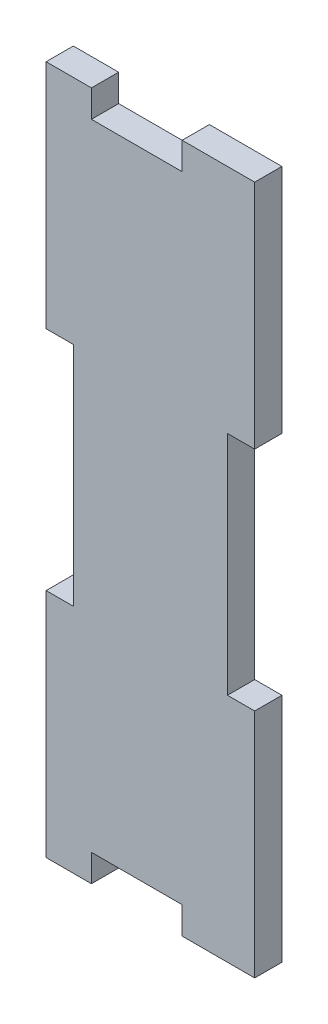
ISO-10303-21;
HEADER;
FILE_DESCRIPTION(('STEP AP214'),'2;1');
FILE_NAME('part.step','',(''),(''),'','','');
FILE_SCHEMA(('AUTOMOTIVE_DESIGN { 1 0 10303 214 1 1 1 1 }'));
ENDSEC;
DATA;
#1=APPLICATION_CONTEXT('core data for automotive mechanical design processes');
#2=APPLICATION_PROTOCOL_DEFINITION('international standard','automotive_design',2000,#1);
#3=PRODUCT_CONTEXT('',#1,'mechanical');
#4=PRODUCT('Part','Part','',(#3));
#5=PRODUCT_RELATED_PRODUCT_CATEGORY('part','',(#4));
#6=PRODUCT_DEFINITION_FORMATION('','',#4);
#7=PRODUCT_DEFINITION_CONTEXT('part definition',#1,'design');
#8=PRODUCT_DEFINITION('design','',#6,#7);
#9=PRODUCT_DEFINITION_SHAPE('','',#8);
#10=(LENGTH_UNIT() NAMED_UNIT(*) SI_UNIT(.MILLI.,.METRE.));
#11=(NAMED_UNIT(*) PLANE_ANGLE_UNIT() SI_UNIT($,.RADIAN.));
#12=(NAMED_UNIT(*) SI_UNIT($,.STERADIAN.) SOLID_ANGLE_UNIT());
#13=UNCERTAINTY_MEASURE_WITH_UNIT(LENGTH_MEASURE(1.E-05),#10,'distance_accuracy_value','');
#14=(GEOMETRIC_REPRESENTATION_CONTEXT(3) GLOBAL_UNCERTAINTY_ASSIGNED_CONTEXT((#13)) GLOBAL_UNIT_ASSIGNED_CONTEXT((#10,
#11,#12)) REPRESENTATION_CONTEXT('',''));
#15=CARTESIAN_POINT('',(0.,0.,0.));
#16=DIRECTION('',(0.,0.,1.));
#17=DIRECTION('',(1.,0.,0.));
#18=AXIS2_PLACEMENT_3D('',#15,#16,#17);
#19=CARTESIAN_POINT('',(5.,76.,3.));
#20=DIRECTION('',(0.,-1.,0.));
#21=DIRECTION('',(0.,0.,-1.));
#22=AXIS2_PLACEMENT_3D('',#19,#20,#21);
#23=PLANE('',#22);
#24=DIRECTION('',(-1.,0.,0.));
#25=VECTOR('',#24,1.);
#26=CARTESIAN_POINT('',(5.,76.,0.));
#27=LINE('',#26,#25);
#28=CARTESIAN_POINT('',(5.,76.,0.));
#29=VERTEX_POINT('',#28);
#30=CARTESIAN_POINT('',(0.,76.,0.));
#31=VERTEX_POINT('',#30);
#32=EDGE_CURVE('E201',#29,#31,#27,.T.);
#33=ORIENTED_EDGE('',*,*,#32,.T.);
#34=DIRECTION('',(0.,0.,-1.));
#35=VECTOR('',#34,1.);
#36=CARTESIAN_POINT('',(0.,76.,3.));
#37=LINE('',#36,#35);
#38=CARTESIAN_POINT('',(0.,76.,3.));
#39=VERTEX_POINT('',#38);
#40=EDGE_CURVE('E11',#39,#31,#37,.T.);
#41=ORIENTED_EDGE('',*,*,#40,.F.);
#42=DIRECTION('',(-1.,0.,0.));
#43=VECTOR('',#42,1.);
#44=CARTESIAN_POINT('',(5.,76.,3.));
#45=LINE('',#44,#43);
#46=CARTESIAN_POINT('',(5.,76.,3.));
#47=VERTEX_POINT('',#46);
#48=EDGE_CURVE('E239',#47,#39,#45,.T.);
#49=ORIENTED_EDGE('',*,*,#48,.F.);
#50=DIRECTION('',(0.,0.,-1.));
#51=VECTOR('',#50,1.);
#52=CARTESIAN_POINT('',(5.,76.,3.));
#53=LINE('',#52,#51);
#54=EDGE_CURVE('E197',#47,#29,#53,.T.);
#55=ORIENTED_EDGE('',*,*,#54,.T.);
#56=EDGE_LOOP('',(#33,#41,#49,#55));
#57=FACE_BOUND('',#56,.T.);
#58=ADVANCED_FACE('F33',(#57),#23,.F.);
#59=CARTESIAN_POINT('',(0.,76.,3.));
#60=DIRECTION('',(1.,0.,0.));
#61=DIRECTION('',(0.,0.,-1.));
#62=AXIS2_PLACEMENT_3D('',#59,#60,#61);
#63=PLANE('',#62);
#64=DIRECTION('',(0.,-1.,0.));
#65=VECTOR('',#64,1.);
#66=CARTESIAN_POINT('',(0.,76.,0.));
#67=LINE('',#66,#65);
#68=CARTESIAN_POINT('',(0.,50.5,0.));
#69=VERTEX_POINT('',#68);
#70=EDGE_CURVE('E204',#31,#69,#67,.T.);
#71=ORIENTED_EDGE('',*,*,#70,.T.);
#72=DIRECTION('',(0.,0.,-1.));
#73=VECTOR('',#72,1.);
#74=CARTESIAN_POINT('',(0.,50.5,3.));
#75=LINE('',#74,#73);
#76=CARTESIAN_POINT('',(0.,50.5,3.));
#77=VERTEX_POINT('',#76);
#78=EDGE_CURVE('E41',#77,#69,#75,.T.);
#79=ORIENTED_EDGE('',*,*,#78,.F.);
#80=DIRECTION('',(0.,-1.,0.));
#81=VECTOR('',#80,1.);
#82=CARTESIAN_POINT('',(0.,76.,3.));
#83=LINE('',#82,#81);
#84=EDGE_CURVE('E128',#39,#77,#83,.T.);
#85=ORIENTED_EDGE('',*,*,#84,.F.);
#86=ORIENTED_EDGE('',*,*,#40,.T.);
#87=EDGE_LOOP('',(#71,#79,#85,#86));
#88=FACE_BOUND('',#87,.T.);
#89=ADVANCED_FACE('F357',(#88),#63,.F.);
#90=CARTESIAN_POINT('',(0.,50.5,3.));
#91=DIRECTION('',(0.,1.,0.));
#92=DIRECTION('',(0.,0.,1.));
#93=AXIS2_PLACEMENT_3D('',#90,#91,#92);
#94=PLANE('',#93);
#95=DIRECTION('',(1.,0.,0.));
#96=VECTOR('',#95,1.);
#97=CARTESIAN_POINT('',(0.,50.5,0.));
#98=LINE('',#97,#96);
#99=CARTESIAN_POINT('',(3.00000000000001,50.5,0.));
#100=VERTEX_POINT('',#99);
#101=EDGE_CURVE('E206',#69,#100,#98,.T.);
#102=ORIENTED_EDGE('',*,*,#101,.T.);
#103=DIRECTION('',(0.,0.,-1.));
#104=VECTOR('',#103,1.);
#105=CARTESIAN_POINT('',(3.00000000000001,50.5,3.));
#106=LINE('',#105,#104);
#107=CARTESIAN_POINT('',(3.00000000000001,50.5,3.));
#108=VERTEX_POINT('',#107);
#109=EDGE_CURVE('E282',#108,#100,#106,.T.);
#110=ORIENTED_EDGE('',*,*,#109,.F.);
#111=DIRECTION('',(1.,0.,0.));
#112=VECTOR('',#111,1.);
#113=CARTESIAN_POINT('',(0.,50.5,3.));
#114=LINE('',#113,#112);
#115=EDGE_CURVE('E290',#77,#108,#114,.T.);
#116=ORIENTED_EDGE('',*,*,#115,.F.);
#117=ORIENTED_EDGE('',*,*,#78,.T.);
#118=EDGE_LOOP('',(#102,#110,#116,#117));
#119=FACE_BOUND('',#118,.T.);
#120=ADVANCED_FACE('F288',(#119),#94,.F.);
#121=CARTESIAN_POINT('',(3.00000000000001,50.5,3.));
#122=DIRECTION('',(1.,0.,0.));
#123=DIRECTION('',(0.,1.,0.));
#124=AXIS2_PLACEMENT_3D('',#121,#122,#123);
#125=PLANE('',#124);
#126=DIRECTION('',(0.,-1.,0.));
#127=VECTOR('',#126,1.);
#128=CARTESIAN_POINT('',(3.00000000000001,50.5,0.));
#129=LINE('',#128,#127);
#130=CARTESIAN_POINT('',(3.00000000000001,25.5,0.));
#131=VERTEX_POINT('',#130);
#132=EDGE_CURVE('E208',#100,#131,#129,.T.);
#133=ORIENTED_EDGE('',*,*,#132,.T.);
#134=DIRECTION('',(0.,0.,-1.));
#135=VECTOR('',#134,1.);
#136=CARTESIAN_POINT('',(3.00000000000001,25.5,3.));
#137=LINE('',#136,#135);
#138=CARTESIAN_POINT('',(3.00000000000001,25.5,3.));
#139=VERTEX_POINT('',#138);
#140=EDGE_CURVE('E279',#139,#131,#137,.T.);
#141=ORIENTED_EDGE('',*,*,#140,.F.);
#142=DIRECTION('',(0.,-1.,0.));
#143=VECTOR('',#142,1.);
#144=CARTESIAN_POINT('',(3.00000000000001,50.5,3.));
#145=LINE('',#144,#143);
#146=EDGE_CURVE('E308',#108,#139,#145,.T.);
#147=ORIENTED_EDGE('',*,*,#146,.F.);
#148=ORIENTED_EDGE('',*,*,#109,.T.);
#149=EDGE_LOOP('',(#133,#141,#147,#148));
#150=FACE_BOUND('',#149,.T.);
#151=ADVANCED_FACE('F299',(#150),#125,.F.);
#152=CARTESIAN_POINT('',(0.,25.5,3.));
#153=DIRECTION('',(0.,-1.,0.));
#154=DIRECTION('',(1.,0.,0.));
#155=AXIS2_PLACEMENT_3D('',#152,#153,#154);
#156=PLANE('',#155);
#157=DIRECTION('',(-1.,0.,0.));
#158=VECTOR('',#157,1.);
#159=CARTESIAN_POINT('',(0.,25.5,0.));
#160=LINE('',#159,#158);
#161=CARTESIAN_POINT('',(0.,25.5,0.));
#162=VERTEX_POINT('',#161);
#163=EDGE_CURVE('E210',#131,#162,#160,.T.);
#164=ORIENTED_EDGE('',*,*,#163,.T.);
#165=DIRECTION('',(0.,0.,-1.));
#166=VECTOR('',#165,1.);
#167=CARTESIAN_POINT('',(0.,25.5,3.));
#168=LINE('',#167,#166);
#169=CARTESIAN_POINT('',(0.,25.5,3.));
#170=VERTEX_POINT('',#169);
#171=EDGE_CURVE('E276',#170,#162,#168,.T.);
#172=ORIENTED_EDGE('',*,*,#171,.F.);
#173=DIRECTION('',(-1.,0.,0.));
#174=VECTOR('',#173,1.);
#175=CARTESIAN_POINT('',(0.,25.5,3.));
#176=LINE('',#175,#174);
#177=EDGE_CURVE('E305',#139,#170,#176,.T.);
#178=ORIENTED_EDGE('',*,*,#177,.F.);
#179=ORIENTED_EDGE('',*,*,#140,.T.);
#180=EDGE_LOOP('',(#164,#172,#178,#179));
#181=FACE_BOUND('',#180,.T.);
#182=ADVANCED_FACE('F303',(#181),#156,.F.);
#183=CARTESIAN_POINT('',(0.,25.5,3.));
#184=DIRECTION('',(1.,0.,0.));
#185=DIRECTION('',(0.,0.,-1.));
#186=AXIS2_PLACEMENT_3D('',#183,#184,#185);
#187=PLANE('',#186);
#188=DIRECTION('',(0.,-1.,0.));
#189=VECTOR('',#188,1.);
#190=CARTESIAN_POINT('',(0.,25.5,0.));
#191=LINE('',#190,#189);
#192=CARTESIAN_POINT('',(0.,0.,0.));
#193=VERTEX_POINT('',#192);
#194=EDGE_CURVE('E212',#162,#193,#191,.T.);
#195=ORIENTED_EDGE('',*,*,#194,.T.);
#196=DIRECTION('',(0.,0.,-1.));
#197=VECTOR('',#196,1.);
#198=CARTESIAN_POINT('',(0.,0.,3.));
#199=LINE('',#198,#197);
#200=CARTESIAN_POINT('',(0.,0.,3.));
#201=VERTEX_POINT('',#200);
#202=EDGE_CURVE('E273',#201,#193,#199,.T.);
#203=ORIENTED_EDGE('',*,*,#202,.F.);
#204=DIRECTION('',(0.,-1.,0.));
#205=VECTOR('',#204,1.);
#206=CARTESIAN_POINT('',(0.,25.5,3.));
#207=LINE('',#206,#205);
#208=EDGE_CURVE('E307',#170,#201,#207,.T.);
#209=ORIENTED_EDGE('',*,*,#208,.F.);
#210=ORIENTED_EDGE('',*,*,#171,.T.);
#211=EDGE_LOOP('',(#195,#203,#209,#210));
#212=FACE_BOUND('',#211,.T.);
#213=ADVANCED_FACE('F370',(#212),#187,.F.);
#214=CARTESIAN_POINT('',(0.,0.,3.));
#215=DIRECTION('',(0.,1.,0.));
#216=DIRECTION('',(0.,0.,1.));
#217=AXIS2_PLACEMENT_3D('',#214,#215,#216);
#218=PLANE('',#217);
#219=DIRECTION('',(1.,0.,0.));
#220=VECTOR('',#219,1.);
#221=CARTESIAN_POINT('',(0.,0.,0.));
#222=LINE('',#221,#220);
#223=CARTESIAN_POINT('',(5.,0.,0.));
#224=VERTEX_POINT('',#223);
#225=EDGE_CURVE('E214',#193,#224,#222,.T.);
#226=ORIENTED_EDGE('',*,*,#225,.T.);
#227=DIRECTION('',(0.,0.,-1.));
#228=VECTOR('',#227,1.);
#229=CARTESIAN_POINT('',(5.,0.,3.));
#230=LINE('',#229,#228);
#231=CARTESIAN_POINT('',(5.,0.,3.));
#232=VERTEX_POINT('',#231);
#233=EDGE_CURVE('E270',#232,#224,#230,.T.);
#234=ORIENTED_EDGE('',*,*,#233,.F.);
#235=DIRECTION('',(1.,0.,0.));
#236=VECTOR('',#235,1.);
#237=CARTESIAN_POINT('',(0.,0.,3.));
#238=LINE('',#237,#236);
#239=EDGE_CURVE('E310',#201,#232,#238,.T.);
#240=ORIENTED_EDGE('',*,*,#239,.F.);
#241=ORIENTED_EDGE('',*,*,#202,.T.);
#242=EDGE_LOOP('',(#226,#234,#240,#241));
#243=FACE_BOUND('',#242,.T.);
#244=ADVANCED_FACE('F373',(#243),#218,.F.);
#245=CARTESIAN_POINT('',(5.,0.,3.));
#246=DIRECTION('',(-1.,0.,0.));
#247=DIRECTION('',(0.,0.,1.));
#248=AXIS2_PLACEMENT_3D('',#245,#246,#247);
#249=PLANE('',#248);
#250=DIRECTION('',(0.,1.,0.));
#251=VECTOR('',#250,1.);
#252=CARTESIAN_POINT('',(5.,0.,0.));
#253=LINE('',#252,#251);
#254=CARTESIAN_POINT('',(5.,3.,0.));
#255=VERTEX_POINT('',#254);
#256=EDGE_CURVE('E216',#224,#255,#253,.T.);
#257=ORIENTED_EDGE('',*,*,#256,.T.);
#258=DIRECTION('',(0.,0.,-1.));
#259=VECTOR('',#258,1.);
#260=CARTESIAN_POINT('',(5.,3.,3.));
#261=LINE('',#260,#259);
#262=CARTESIAN_POINT('',(5.,3.,3.));
#263=VERTEX_POINT('',#262);
#264=EDGE_CURVE('E267',#263,#255,#261,.T.);
#265=ORIENTED_EDGE('',*,*,#264,.F.);
#266=DIRECTION('',(0.,1.,0.));
#267=VECTOR('',#266,1.);
#268=CARTESIAN_POINT('',(5.,0.,3.));
#269=LINE('',#268,#267);
#270=EDGE_CURVE('E316',#232,#263,#269,.T.);
#271=ORIENTED_EDGE('',*,*,#270,.F.);
#272=ORIENTED_EDGE('',*,*,#233,.T.);
#273=EDGE_LOOP('',(#257,#265,#271,#272));
#274=FACE_BOUND('',#273,.T.);
#275=ADVANCED_FACE('F377',(#274),#249,.F.);
#276=CARTESIAN_POINT('',(5.,3.,3.));
#277=DIRECTION('',(0.,1.,0.));
#278=DIRECTION('',(0.,0.,1.));
#279=AXIS2_PLACEMENT_3D('',#276,#277,#278);
#280=PLANE('',#279);
#281=DIRECTION('',(1.,0.,0.));
#282=VECTOR('',#281,1.);
#283=CARTESIAN_POINT('',(5.,3.,0.));
#284=LINE('',#283,#282);
#285=CARTESIAN_POINT('',(15.,3.,0.));
#286=VERTEX_POINT('',#285);
#287=EDGE_CURVE('E218',#255,#286,#284,.T.);
#288=ORIENTED_EDGE('',*,*,#287,.T.);
#289=DIRECTION('',(0.,0.,-1.));
#290=VECTOR('',#289,1.);
#291=CARTESIAN_POINT('',(15.,3.,3.));
#292=LINE('',#291,#290);
#293=CARTESIAN_POINT('',(15.,3.,3.));
#294=VERTEX_POINT('',#293);
#295=EDGE_CURVE('E264',#294,#286,#292,.T.);
#296=ORIENTED_EDGE('',*,*,#295,.F.);
#297=DIRECTION('',(1.,0.,0.));
#298=VECTOR('',#297,1.);
#299=CARTESIAN_POINT('',(5.,3.,3.));
#300=LINE('',#299,#298);
#301=EDGE_CURVE('E318',#263,#294,#300,.T.);
#302=ORIENTED_EDGE('',*,*,#301,.F.);
#303=ORIENTED_EDGE('',*,*,#264,.T.);
#304=EDGE_LOOP('',(#288,#296,#302,#303));
#305=FACE_BOUND('',#304,.T.);
#306=ADVANCED_FACE('F381',(#305),#280,.F.);
#307=CARTESIAN_POINT('',(15.,3.,3.));
#308=DIRECTION('',(1.,0.,0.));
#309=DIRECTION('',(0.,1.,0.));
#310=AXIS2_PLACEMENT_3D('',#307,#308,#309);
#311=PLANE('',#310);
#312=DIRECTION('',(0.,-1.,0.));
#313=VECTOR('',#312,1.);
#314=CARTESIAN_POINT('',(15.,3.,0.));
#315=LINE('',#314,#313);
#316=CARTESIAN_POINT('',(15.,0.,0.));
#317=VERTEX_POINT('',#316);
#318=EDGE_CURVE('E220',#286,#317,#315,.T.);
#319=ORIENTED_EDGE('',*,*,#318,.T.);
#320=DIRECTION('',(0.,0.,-1.));
#321=VECTOR('',#320,1.);
#322=CARTESIAN_POINT('',(15.,0.,3.));
#323=LINE('',#322,#321);
#324=CARTESIAN_POINT('',(15.,0.,3.));
#325=VERTEX_POINT('',#324);
#326=EDGE_CURVE('E261',#325,#317,#323,.T.);
#327=ORIENTED_EDGE('',*,*,#326,.F.);
#328=DIRECTION('',(0.,-1.,0.));
#329=VECTOR('',#328,1.);
#330=CARTESIAN_POINT('',(15.,3.,3.));
#331=LINE('',#330,#329);
#332=EDGE_CURVE('E320',#294,#325,#331,.T.);
#333=ORIENTED_EDGE('',*,*,#332,.F.);
#334=ORIENTED_EDGE('',*,*,#295,.T.);
#335=EDGE_LOOP('',(#319,#327,#333,#334));
#336=FACE_BOUND('',#335,.T.);
#337=ADVANCED_FACE('F385',(#336),#311,.F.);
#338=CARTESIAN_POINT('',(15.,0.,3.));
#339=DIRECTION('',(0.,1.,0.));
#340=DIRECTION('',(-1.,0.,0.));
#341=AXIS2_PLACEMENT_3D('',#338,#339,#340);
#342=PLANE('',#341);
#343=DIRECTION('',(1.,0.,0.));
#344=VECTOR('',#343,1.);
#345=CARTESIAN_POINT('',(15.,0.,0.));
#346=LINE('',#345,#344);
#347=CARTESIAN_POINT('',(23.,0.,0.));
#348=VERTEX_POINT('',#347);
#349=EDGE_CURVE('E222',#317,#348,#346,.T.);
#350=ORIENTED_EDGE('',*,*,#349,.T.);
#351=DIRECTION('',(0.,0.,-1.));
#352=VECTOR('',#351,1.);
#353=CARTESIAN_POINT('',(23.,0.,3.));
#354=LINE('',#353,#352);
#355=CARTESIAN_POINT('',(23.,0.,3.));
#356=VERTEX_POINT('',#355);
#357=EDGE_CURVE('E258',#356,#348,#354,.T.);
#358=ORIENTED_EDGE('',*,*,#357,.F.);
#359=DIRECTION('',(1.,0.,0.));
#360=VECTOR('',#359,1.);
#361=CARTESIAN_POINT('',(15.,0.,3.));
#362=LINE('',#361,#360);
#363=EDGE_CURVE('E322',#325,#356,#362,.T.);
#364=ORIENTED_EDGE('',*,*,#363,.F.);
#365=ORIENTED_EDGE('',*,*,#326,.T.);
#366=EDGE_LOOP('',(#350,#358,#364,#365));
#367=FACE_BOUND('',#366,.T.);
#368=ADVANCED_FACE('F389',(#367),#342,.F.);
#369=CARTESIAN_POINT('',(23.,0.,3.));
#370=DIRECTION('',(-1.,0.,0.));
#371=DIRECTION('',(0.,-1.,0.));
#372=AXIS2_PLACEMENT_3D('',#369,#370,#371);
#373=PLANE('',#372);
#374=DIRECTION('',(0.,1.,0.));
#375=VECTOR('',#374,1.);
#376=CARTESIAN_POINT('',(23.,0.,0.));
#377=LINE('',#376,#375);
#378=CARTESIAN_POINT('',(23.,25.5,0.));
#379=VERTEX_POINT('',#378);
#380=EDGE_CURVE('E224',#348,#379,#377,.T.);
#381=ORIENTED_EDGE('',*,*,#380,.T.);
#382=DIRECTION('',(0.,0.,-1.));
#383=VECTOR('',#382,1.);
#384=CARTESIAN_POINT('',(23.,25.5,3.));
#385=LINE('',#384,#383);
#386=CARTESIAN_POINT('',(23.,25.5,3.));
#387=VERTEX_POINT('',#386);
#388=EDGE_CURVE('E255',#387,#379,#385,.T.);
#389=ORIENTED_EDGE('',*,*,#388,.F.);
#390=DIRECTION('',(0.,1.,0.));
#391=VECTOR('',#390,1.);
#392=CARTESIAN_POINT('',(23.,0.,3.));
#393=LINE('',#392,#391);
#394=EDGE_CURVE('E324',#356,#387,#393,.T.);
#395=ORIENTED_EDGE('',*,*,#394,.F.);
#396=ORIENTED_EDGE('',*,*,#357,.T.);
#397=EDGE_LOOP('',(#381,#389,#395,#396));
#398=FACE_BOUND('',#397,.T.);
#399=ADVANCED_FACE('F393',(#398),#373,.F.);
#400=CARTESIAN_POINT('',(23.,25.5,3.));
#401=DIRECTION('',(0.,-1.,0.));
#402=DIRECTION('',(1.,0.,0.));
#403=AXIS2_PLACEMENT_3D('',#400,#401,#402);
#404=PLANE('',#403);
#405=DIRECTION('',(-1.,0.,0.));
#406=VECTOR('',#405,1.);
#407=CARTESIAN_POINT('',(23.,25.5,0.));
#408=LINE('',#407,#406);
#409=CARTESIAN_POINT('',(20.,25.5,0.));
#410=VERTEX_POINT('',#409);
#411=EDGE_CURVE('E226',#379,#410,#408,.T.);
#412=ORIENTED_EDGE('',*,*,#411,.T.);
#413=DIRECTION('',(0.,0.,-1.));
#414=VECTOR('',#413,1.);
#415=CARTESIAN_POINT('',(20.,25.5,3.));
#416=LINE('',#415,#414);
#417=CARTESIAN_POINT('',(20.,25.5,3.));
#418=VERTEX_POINT('',#417);
#419=EDGE_CURVE('E252',#418,#410,#416,.T.);
#420=ORIENTED_EDGE('',*,*,#419,.F.);
#421=DIRECTION('',(-1.,0.,0.));
#422=VECTOR('',#421,1.);
#423=CARTESIAN_POINT('',(23.,25.5,3.));
#424=LINE('',#423,#422);
#425=EDGE_CURVE('E326',#387,#418,#424,.T.);
#426=ORIENTED_EDGE('',*,*,#425,.F.);
#427=ORIENTED_EDGE('',*,*,#388,.T.);
#428=EDGE_LOOP('',(#412,#420,#426,#427));
#429=FACE_BOUND('',#428,.T.);
#430=ADVANCED_FACE('F397',(#429),#404,.F.);
#431=CARTESIAN_POINT('',(20.,25.5,3.));
#432=DIRECTION('',(-1.,0.,0.));
#433=DIRECTION('',(0.,0.,1.));
#434=AXIS2_PLACEMENT_3D('',#431,#432,#433);
#435=PLANE('',#434);
#436=DIRECTION('',(0.,1.,0.));
#437=VECTOR('',#436,1.);
#438=CARTESIAN_POINT('',(20.,25.5,0.));
#439=LINE('',#438,#437);
#440=CARTESIAN_POINT('',(20.,50.5,0.));
#441=VERTEX_POINT('',#440);
#442=EDGE_CURVE('E228',#410,#441,#439,.T.);
#443=ORIENTED_EDGE('',*,*,#442,.T.);
#444=DIRECTION('',(0.,0.,-1.));
#445=VECTOR('',#444,1.);
#446=CARTESIAN_POINT('',(20.,50.5,3.));
#447=LINE('',#446,#445);
#448=CARTESIAN_POINT('',(20.,50.5,3.));
#449=VERTEX_POINT('',#448);
#450=EDGE_CURVE('E249',#449,#441,#447,.T.);
#451=ORIENTED_EDGE('',*,*,#450,.F.);
#452=DIRECTION('',(0.,1.,0.));
#453=VECTOR('',#452,1.);
#454=CARTESIAN_POINT('',(20.,25.5,3.));
#455=LINE('',#454,#453);
#456=EDGE_CURVE('E328',#418,#449,#455,.T.);
#457=ORIENTED_EDGE('',*,*,#456,.F.);
#458=ORIENTED_EDGE('',*,*,#419,.T.);
#459=EDGE_LOOP('',(#443,#451,#457,#458));
#460=FACE_BOUND('',#459,.T.);
#461=ADVANCED_FACE('F401',(#460),#435,.F.);
#462=CARTESIAN_POINT('',(20.,50.5,3.));
#463=DIRECTION('',(0.,1.,0.));
#464=DIRECTION('',(0.,0.,1.));
#465=AXIS2_PLACEMENT_3D('',#462,#463,#464);
#466=PLANE('',#465);
#467=DIRECTION('',(1.,0.,0.));
#468=VECTOR('',#467,1.);
#469=CARTESIAN_POINT('',(20.,50.5,0.));
#470=LINE('',#469,#468);
#471=CARTESIAN_POINT('',(23.,50.5,0.));
#472=VERTEX_POINT('',#471);
#473=EDGE_CURVE('E230',#441,#472,#470,.T.);
#474=ORIENTED_EDGE('',*,*,#473,.T.);
#475=DIRECTION('',(0.,0.,-1.));
#476=VECTOR('',#475,1.);
#477=CARTESIAN_POINT('',(23.,50.5,3.));
#478=LINE('',#477,#476);
#479=CARTESIAN_POINT('',(23.,50.5,3.));
#480=VERTEX_POINT('',#479);
#481=EDGE_CURVE('E246',#480,#472,#478,.T.);
#482=ORIENTED_EDGE('',*,*,#481,.F.);
#483=DIRECTION('',(1.,0.,0.));
#484=VECTOR('',#483,1.);
#485=CARTESIAN_POINT('',(20.,50.5,3.));
#486=LINE('',#485,#484);
#487=EDGE_CURVE('E330',#449,#480,#486,.T.);
#488=ORIENTED_EDGE('',*,*,#487,.F.);
#489=ORIENTED_EDGE('',*,*,#450,.T.);
#490=EDGE_LOOP('',(#474,#482,#488,#489));
#491=FACE_BOUND('',#490,.T.);
#492=ADVANCED_FACE('F405',(#491),#466,.F.);
#493=CARTESIAN_POINT('',(23.,50.5,3.));
#494=DIRECTION('',(-1.,0.,0.));
#495=DIRECTION('',(0.,-1.,0.));
#496=AXIS2_PLACEMENT_3D('',#493,#494,#495);
#497=PLANE('',#496);
#498=DIRECTION('',(0.,1.,0.));
#499=VECTOR('',#498,1.);
#500=CARTESIAN_POINT('',(23.,50.5,0.));
#501=LINE('',#500,#499);
#502=CARTESIAN_POINT('',(23.,76.,0.));
#503=VERTEX_POINT('',#502);
#504=EDGE_CURVE('E232',#472,#503,#501,.T.);
#505=ORIENTED_EDGE('',*,*,#504,.T.);
#506=DIRECTION('',(0.,0.,-1.));
#507=VECTOR('',#506,1.);
#508=CARTESIAN_POINT('',(23.,76.,3.));
#509=LINE('',#508,#507);
#510=CARTESIAN_POINT('',(23.,76.,3.));
#511=VERTEX_POINT('',#510);
#512=EDGE_CURVE('E243',#511,#503,#509,.T.);
#513=ORIENTED_EDGE('',*,*,#512,.F.);
#514=DIRECTION('',(0.,1.,0.));
#515=VECTOR('',#514,1.);
#516=CARTESIAN_POINT('',(23.,50.5,3.));
#517=LINE('',#516,#515);
#518=EDGE_CURVE('E332',#480,#511,#517,.T.);
#519=ORIENTED_EDGE('',*,*,#518,.F.);
#520=ORIENTED_EDGE('',*,*,#481,.T.);
#521=EDGE_LOOP('',(#505,#513,#519,#520));
#522=FACE_BOUND('',#521,.T.);
#523=ADVANCED_FACE('F338',(#522),#497,.F.);
#524=CARTESIAN_POINT('',(23.,76.,3.));
#525=DIRECTION('',(0.,-1.,0.));
#526=DIRECTION('',(0.,0.,-1.));
#527=AXIS2_PLACEMENT_3D('',#524,#525,#526);
#528=PLANE('',#527);
#529=DIRECTION('',(-1.,0.,0.));
#530=VECTOR('',#529,1.);
#531=CARTESIAN_POINT('',(23.,76.,0.));
#532=LINE('',#531,#530);
#533=CARTESIAN_POINT('',(15.,76.,0.));
#534=VERTEX_POINT('',#533);
#535=EDGE_CURVE('E234',#503,#534,#532,.T.);
#536=ORIENTED_EDGE('',*,*,#535,.T.);
#537=DIRECTION('',(0.,0.,-1.));
#538=VECTOR('',#537,1.);
#539=CARTESIAN_POINT('',(15.,76.,3.));
#540=LINE('',#539,#538);
#541=CARTESIAN_POINT('',(15.,76.,3.));
#542=VERTEX_POINT('',#541);
#543=EDGE_CURVE('E192',#542,#534,#540,.T.);
#544=ORIENTED_EDGE('',*,*,#543,.F.);
#545=DIRECTION('',(-1.,0.,0.));
#546=VECTOR('',#545,1.);
#547=CARTESIAN_POINT('',(23.,76.,3.));
#548=LINE('',#547,#546);
#549=EDGE_CURVE('E183',#511,#542,#548,.T.);
#550=ORIENTED_EDGE('',*,*,#549,.F.);
#551=ORIENTED_EDGE('',*,*,#512,.T.);
#552=EDGE_LOOP('',(#536,#544,#550,#551));
#553=FACE_BOUND('',#552,.T.);
#554=ADVANCED_FACE('F342',(#553),#528,.F.);
#555=CARTESIAN_POINT('',(15.,76.,3.));
#556=DIRECTION('',(1.,0.,0.));
#557=DIRECTION('',(0.,0.,-1.));
#558=AXIS2_PLACEMENT_3D('',#555,#556,#557);
#559=PLANE('',#558);
#560=DIRECTION('',(0.,-1.,0.));
#561=VECTOR('',#560,1.);
#562=CARTESIAN_POINT('',(15.,76.,0.));
#563=LINE('',#562,#561);
#564=CARTESIAN_POINT('',(15.,73.,0.));
#565=VERTEX_POINT('',#564);
#566=EDGE_CURVE('E191',#534,#565,#563,.T.);
#567=ORIENTED_EDGE('',*,*,#566,.T.);
#568=DIRECTION('',(0.,0.,-1.));
#569=VECTOR('',#568,1.);
#570=CARTESIAN_POINT('',(15.,73.,3.));
#571=LINE('',#570,#569);
#572=CARTESIAN_POINT('',(15.,73.,3.));
#573=VERTEX_POINT('',#572);
#574=EDGE_CURVE('E188',#573,#565,#571,.T.);
#575=ORIENTED_EDGE('',*,*,#574,.F.);
#576=DIRECTION('',(0.,-1.,0.));
#577=VECTOR('',#576,1.);
#578=CARTESIAN_POINT('',(15.,76.,3.));
#579=LINE('',#578,#577);
#580=EDGE_CURVE('E177',#542,#573,#579,.T.);
#581=ORIENTED_EDGE('',*,*,#580,.F.);
#582=ORIENTED_EDGE('',*,*,#543,.T.);
#583=EDGE_LOOP('',(#567,#575,#581,#582));
#584=FACE_BOUND('',#583,.T.);
#585=ADVANCED_FACE('F189',(#584),#559,.F.);
#586=CARTESIAN_POINT('',(15.,73.,3.));
#587=DIRECTION('',(0.,-1.,0.));
#588=DIRECTION('',(0.,0.,-1.));
#589=AXIS2_PLACEMENT_3D('',#586,#587,#588);
#590=PLANE('',#589);
#591=DIRECTION('',(-1.,0.,0.));
#592=VECTOR('',#591,1.);
#593=CARTESIAN_POINT('',(15.,73.,0.));
#594=LINE('',#593,#592);
#595=CARTESIAN_POINT('',(5.,73.,0.));
#596=VERTEX_POINT('',#595);
#597=EDGE_CURVE('E114',#565,#596,#594,.T.);
#598=ORIENTED_EDGE('',*,*,#597,.T.);
#599=DIRECTION('',(0.,0.,-1.));
#600=VECTOR('',#599,1.);
#601=CARTESIAN_POINT('',(5.,73.,3.));
#602=LINE('',#601,#600);
#603=CARTESIAN_POINT('',(5.,73.,3.));
#604=VERTEX_POINT('',#603);
#605=EDGE_CURVE('E193',#604,#596,#602,.T.);
#606=ORIENTED_EDGE('',*,*,#605,.F.);
#607=DIRECTION('',(-1.,0.,0.));
#608=VECTOR('',#607,1.);
#609=CARTESIAN_POINT('',(15.,73.,3.));
#610=LINE('',#609,#608);
#611=EDGE_CURVE('E181',#573,#604,#610,.T.);
#612=ORIENTED_EDGE('',*,*,#611,.F.);
#613=ORIENTED_EDGE('',*,*,#574,.T.);
#614=EDGE_LOOP('',(#598,#606,#612,#613));
#615=FACE_BOUND('',#614,.T.);
#616=ADVANCED_FACE('F195',(#615),#590,.F.);
#617=CARTESIAN_POINT('',(5.,73.,3.));
#618=DIRECTION('',(-1.,0.,0.));
#619=DIRECTION('',(0.,-1.,0.));
#620=AXIS2_PLACEMENT_3D('',#617,#618,#619);
#621=PLANE('',#620);
#622=DIRECTION('',(0.,1.,0.));
#623=VECTOR('',#622,1.);
#624=CARTESIAN_POINT('',(5.,73.,0.));
#625=LINE('',#624,#623);
#626=EDGE_CURVE('E120',#596,#29,#625,.T.);
#627=ORIENTED_EDGE('',*,*,#626,.T.);
#628=ORIENTED_EDGE('',*,*,#54,.F.);
#629=DIRECTION('',(0.,1.,0.));
#630=VECTOR('',#629,1.);
#631=CARTESIAN_POINT('',(5.,73.,3.));
#632=LINE('',#631,#630);
#633=EDGE_CURVE('E49',#604,#47,#632,.T.);
#634=ORIENTED_EDGE('',*,*,#633,.F.);
#635=ORIENTED_EDGE('',*,*,#605,.T.);
#636=EDGE_LOOP('',(#627,#628,#634,#635));
#637=FACE_BOUND('',#636,.T.);
#638=ADVANCED_FACE('F346',(#637),#621,.F.);
#639=CARTESIAN_POINT('',(0.,0.,3.));
#640=DIRECTION('',(0.,0.,1.));
#641=DIRECTION('',(1.,0.,0.));
#642=AXIS2_PLACEMENT_3D('',#639,#640,#641);
#643=PLANE('',#642);
#644=ORIENTED_EDGE('',*,*,#48,.T.);
#645=ORIENTED_EDGE('',*,*,#84,.T.);
#646=ORIENTED_EDGE('',*,*,#115,.T.);
#647=ORIENTED_EDGE('',*,*,#146,.T.);
#648=ORIENTED_EDGE('',*,*,#177,.T.);
#649=ORIENTED_EDGE('',*,*,#208,.T.);
#650=ORIENTED_EDGE('',*,*,#239,.T.);
#651=ORIENTED_EDGE('',*,*,#270,.T.);
#652=ORIENTED_EDGE('',*,*,#301,.T.);
#653=ORIENTED_EDGE('',*,*,#332,.T.);
#654=ORIENTED_EDGE('',*,*,#363,.T.);
#655=ORIENTED_EDGE('',*,*,#394,.T.);
#656=ORIENTED_EDGE('',*,*,#425,.T.);
#657=ORIENTED_EDGE('',*,*,#456,.T.);
#658=ORIENTED_EDGE('',*,*,#487,.T.);
#659=ORIENTED_EDGE('',*,*,#518,.T.);
#660=ORIENTED_EDGE('',*,*,#549,.T.);
#661=ORIENTED_EDGE('',*,*,#580,.T.);
#662=ORIENTED_EDGE('',*,*,#611,.T.);
#663=ORIENTED_EDGE('',*,*,#633,.T.);
#664=EDGE_LOOP('',(#644,#645,#646,#647,#648,#649,#650,#651,#652,#653,#654,#655,#656,#657,#658,
#659,#660,#661,#662,#663));
#665=FACE_BOUND('',#664,.T.);
#666=ADVANCED_FACE('F179',(#665),#643,.T.);
#667=CARTESIAN_POINT('',(0.,0.,0.));
#668=DIRECTION('',(0.,0.,1.));
#669=DIRECTION('',(1.,0.,0.));
#670=AXIS2_PLACEMENT_3D('',#667,#668,#669);
#671=PLANE('',#670);
#672=ORIENTED_EDGE('',*,*,#32,.F.);
#673=ORIENTED_EDGE('',*,*,#626,.F.);
#674=ORIENTED_EDGE('',*,*,#597,.F.);
#675=ORIENTED_EDGE('',*,*,#566,.F.);
#676=ORIENTED_EDGE('',*,*,#535,.F.);
#677=ORIENTED_EDGE('',*,*,#504,.F.);
#678=ORIENTED_EDGE('',*,*,#473,.F.);
#679=ORIENTED_EDGE('',*,*,#442,.F.);
#680=ORIENTED_EDGE('',*,*,#411,.F.);
#681=ORIENTED_EDGE('',*,*,#380,.F.);
#682=ORIENTED_EDGE('',*,*,#349,.F.);
#683=ORIENTED_EDGE('',*,*,#318,.F.);
#684=ORIENTED_EDGE('',*,*,#287,.F.);
#685=ORIENTED_EDGE('',*,*,#256,.F.);
#686=ORIENTED_EDGE('',*,*,#225,.F.);
#687=ORIENTED_EDGE('',*,*,#194,.F.);
#688=ORIENTED_EDGE('',*,*,#163,.F.);
#689=ORIENTED_EDGE('',*,*,#132,.F.);
#690=ORIENTED_EDGE('',*,*,#101,.F.);
#691=ORIENTED_EDGE('',*,*,#70,.F.);
#692=EDGE_LOOP('',(#672,#673,#674,#675,#676,#677,#678,#679,#680,#681,#682,#683,#684,#685,#686,
#687,#688,#689,#690,#691));
#693=FACE_BOUND('',#692,.T.);
#694=ADVANCED_FACE('F294',(#693),#671,.F.);
#695=CLOSED_SHELL('',(#58,#89,#120,#151,#182,#213,#244,#275,#306,#337,#368,#399,#430,#461,#492,
#523,#554,#585,#616,#638,#666,#694));
#696=MANIFOLD_SOLID_BREP('B2',#695);
#697=ADVANCED_BREP_SHAPE_REPRESENTATION('',(#18,#696),#14);
#698=SHAPE_DEFINITION_REPRESENTATION(#9,#697);
ENDSEC;
END-ISO-10303-21;
